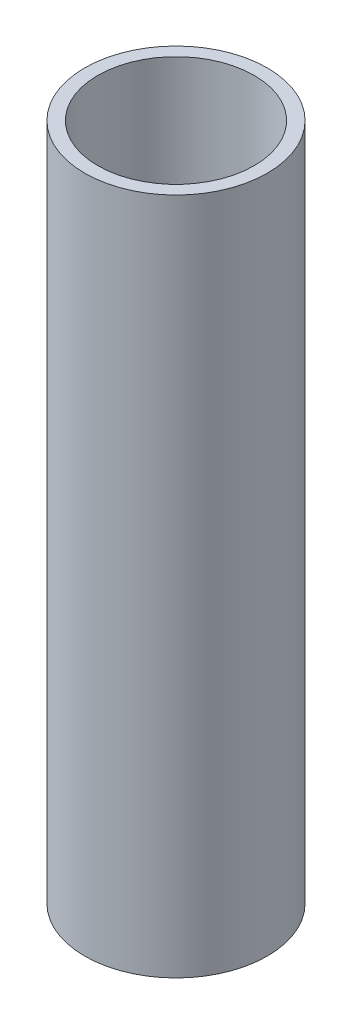
ISO-10303-21;
HEADER;
FILE_DESCRIPTION(('STEP AP214'),'2;1');
FILE_NAME('part.step','',(''),(''),'','','');
FILE_SCHEMA(('AUTOMOTIVE_DESIGN { 1 0 10303 214 1 1 1 1 }'));
ENDSEC;
DATA;
#1=APPLICATION_CONTEXT('core data for automotive mechanical design processes');
#2=APPLICATION_PROTOCOL_DEFINITION('international standard','automotive_design',2000,#1);
#3=PRODUCT_CONTEXT('',#1,'mechanical');
#4=PRODUCT('Part','Part','',(#3));
#5=PRODUCT_RELATED_PRODUCT_CATEGORY('part','',(#4));
#6=PRODUCT_DEFINITION_FORMATION('','',#4);
#7=PRODUCT_DEFINITION_CONTEXT('part definition',#1,'design');
#8=PRODUCT_DEFINITION('design','',#6,#7);
#9=PRODUCT_DEFINITION_SHAPE('','',#8);
#10=(LENGTH_UNIT() NAMED_UNIT(*) SI_UNIT(.MILLI.,.METRE.));
#11=(NAMED_UNIT(*) PLANE_ANGLE_UNIT() SI_UNIT($,.RADIAN.));
#12=(NAMED_UNIT(*) SI_UNIT($,.STERADIAN.) SOLID_ANGLE_UNIT());
#13=UNCERTAINTY_MEASURE_WITH_UNIT(LENGTH_MEASURE(1.E-05),#10,'distance_accuracy_value','');
#14=(GEOMETRIC_REPRESENTATION_CONTEXT(3) GLOBAL_UNCERTAINTY_ASSIGNED_CONTEXT((#13)) GLOBAL_UNIT_ASSIGNED_CONTEXT((#10,
#11,#12)) REPRESENTATION_CONTEXT('',''));
#15=CARTESIAN_POINT('',(0.,0.,0.));
#16=DIRECTION('',(0.,0.,1.));
#17=DIRECTION('',(1.,0.,0.));
#18=AXIS2_PLACEMENT_3D('',#15,#16,#17);
#19=CARTESIAN_POINT('',(0.,130.,0.));
#20=DIRECTION('',(0.,-1.,0.));
#21=DIRECTION('',(0.,0.,-1.));
#22=AXIS2_PLACEMENT_3D('',#19,#20,#21);
#23=CYLINDRICAL_SURFACE('',#22,17.5);
#24=CARTESIAN_POINT('',(0.,130.,0.));
#25=DIRECTION('',(0.,1.,0.));
#26=DIRECTION('',(0.,0.,1.));
#27=AXIS2_PLACEMENT_3D('',#24,#25,#26);
#28=CIRCLE('',#27,17.5);
#29=CARTESIAN_POINT('',(0.,130.,17.5));
#30=VERTEX_POINT('',#29);
#31=EDGE_CURVE('E10',#30,#30,#28,.T.);
#32=ORIENTED_EDGE('',*,*,#31,.F.);
#33=EDGE_LOOP('',(#32));
#34=FACE_BOUND('',#33,.T.);
#35=CARTESIAN_POINT('',(0.,0.,0.));
#36=DIRECTION('',(0.,1.,0.));
#37=DIRECTION('',(0.,0.,1.));
#38=AXIS2_PLACEMENT_3D('',#35,#36,#37);
#39=CIRCLE('',#38,17.5);
#40=CARTESIAN_POINT('',(0.,0.,17.5));
#41=VERTEX_POINT('',#40);
#42=EDGE_CURVE('E37',#41,#41,#39,.T.);
#43=ORIENTED_EDGE('',*,*,#42,.T.);
#44=EDGE_LOOP('',(#43));
#45=FACE_BOUND('',#44,.T.);
#46=ADVANCED_FACE('F34',(#34,#45),#23,.T.);
#47=CARTESIAN_POINT('',(0.,130.,0.));
#48=DIRECTION('',(0.,1.,0.));
#49=DIRECTION('',(0.,0.,1.));
#50=AXIS2_PLACEMENT_3D('',#47,#48,#49);
#51=PLANE('',#50);
#52=CARTESIAN_POINT('',(0.,130.,0.));
#53=DIRECTION('',(0.,-1.,0.));
#54=DIRECTION('',(0.,0.,-1.));
#55=AXIS2_PLACEMENT_3D('',#52,#53,#54);
#56=CIRCLE('',#55,15.);
#57=CARTESIAN_POINT('',(0.,130.,-15.));
#58=VERTEX_POINT('',#57);
#59=EDGE_CURVE('E44',#58,#58,#56,.T.);
#60=ORIENTED_EDGE('',*,*,#59,.T.);
#61=EDGE_LOOP('',(#60));
#62=FACE_BOUND('',#61,.T.);
#63=ORIENTED_EDGE('',*,*,#31,.T.);
#64=EDGE_LOOP('',(#63));
#65=FACE_BOUND('',#64,.T.);
#66=ADVANCED_FACE('F52',(#62,#65),#51,.T.);
#67=CARTESIAN_POINT('',(0.,0.,0.));
#68=DIRECTION('',(0.,1.,0.));
#69=DIRECTION('',(0.,0.,1.));
#70=AXIS2_PLACEMENT_3D('',#67,#68,#69);
#71=PLANE('',#70);
#72=CARTESIAN_POINT('',(0.,0.,0.));
#73=DIRECTION('',(0.,-1.,0.));
#74=DIRECTION('',(0.,0.,-1.));
#75=AXIS2_PLACEMENT_3D('',#72,#73,#74);
#76=CIRCLE('',#75,15.);
#77=CARTESIAN_POINT('',(0.,0.,-15.));
#78=VERTEX_POINT('',#77);
#79=EDGE_CURVE('E46',#78,#78,#76,.T.);
#80=ORIENTED_EDGE('',*,*,#79,.F.);
#81=EDGE_LOOP('',(#80));
#82=FACE_BOUND('',#81,.T.);
#83=ORIENTED_EDGE('',*,*,#42,.F.);
#84=EDGE_LOOP('',(#83));
#85=FACE_BOUND('',#84,.T.);
#86=ADVANCED_FACE('F57',(#82,#85),#71,.F.);
#87=CARTESIAN_POINT('',(0.,130.,0.));
#88=DIRECTION('',(0.,-1.,0.));
#89=DIRECTION('',(0.,0.,-1.));
#90=AXIS2_PLACEMENT_3D('',#87,#88,#89);
#91=CYLINDRICAL_SURFACE('',#90,15.);
#92=ORIENTED_EDGE('',*,*,#59,.F.);
#93=EDGE_LOOP('',(#92));
#94=FACE_BOUND('',#93,.T.);
#95=ORIENTED_EDGE('',*,*,#79,.T.);
#96=EDGE_LOOP('',(#95));
#97=FACE_BOUND('',#96,.T.);
#98=ADVANCED_FACE('F54',(#94,#97),#91,.F.);
#99=CLOSED_SHELL('',(#46,#66,#86,#98));
#100=MANIFOLD_SOLID_BREP('B2',#99);
#101=ADVANCED_BREP_SHAPE_REPRESENTATION('',(#18,#100),#14);
#102=SHAPE_DEFINITION_REPRESENTATION(#9,#101);
ENDSEC;
END-ISO-10303-21;
